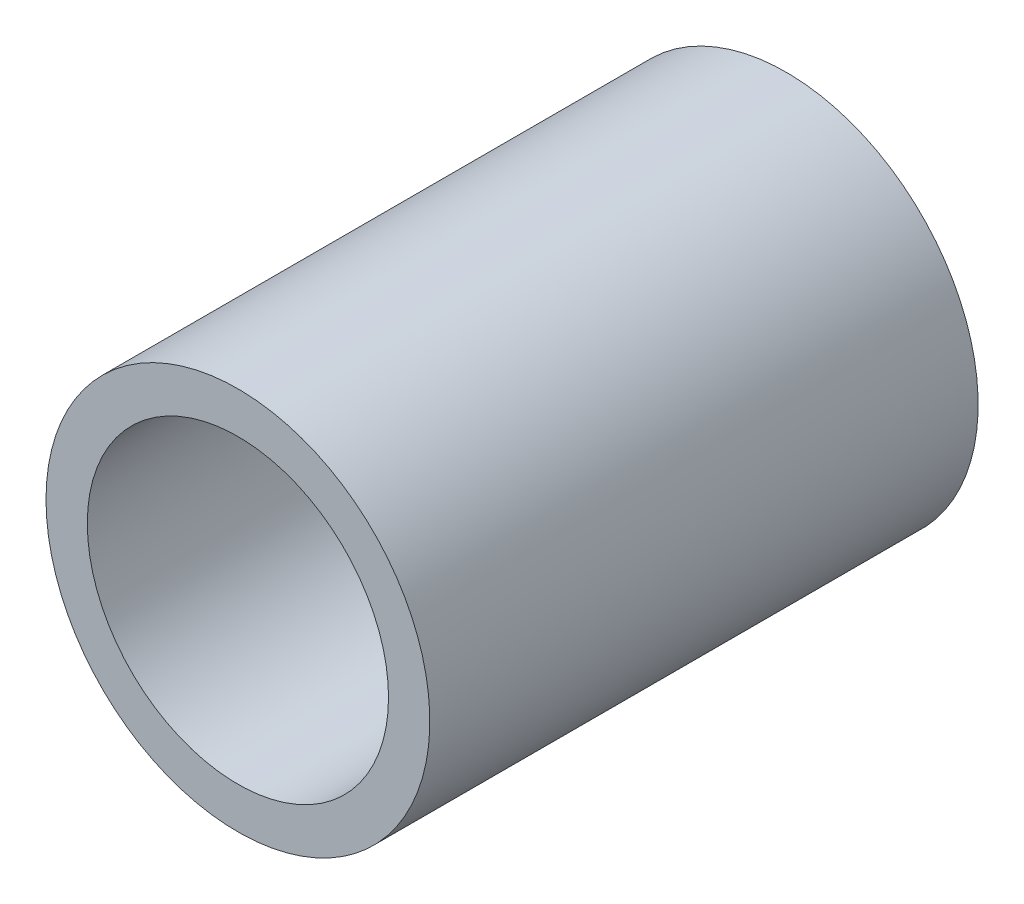
ISO-10303-21;
HEADER;
FILE_DESCRIPTION(('STEP AP214'),'2;1');
FILE_NAME('part.step','',(''),(''),'','','');
FILE_SCHEMA(('AUTOMOTIVE_DESIGN { 1 0 10303 214 1 1 1 1 }'));
ENDSEC;
DATA;
#1=APPLICATION_CONTEXT('core data for automotive mechanical design processes');
#2=APPLICATION_PROTOCOL_DEFINITION('international standard','automotive_design',2000,#1);
#3=PRODUCT_CONTEXT('',#1,'mechanical');
#4=PRODUCT('Part','Part','',(#3));
#5=PRODUCT_RELATED_PRODUCT_CATEGORY('part','',(#4));
#6=PRODUCT_DEFINITION_FORMATION('','',#4);
#7=PRODUCT_DEFINITION_CONTEXT('part definition',#1,'design');
#8=PRODUCT_DEFINITION('design','',#6,#7);
#9=PRODUCT_DEFINITION_SHAPE('','',#8);
#10=(LENGTH_UNIT() NAMED_UNIT(*) SI_UNIT(.MILLI.,.METRE.));
#11=(NAMED_UNIT(*) PLANE_ANGLE_UNIT() SI_UNIT($,.RADIAN.));
#12=(NAMED_UNIT(*) SI_UNIT($,.STERADIAN.) SOLID_ANGLE_UNIT());
#13=UNCERTAINTY_MEASURE_WITH_UNIT(LENGTH_MEASURE(1.E-05),#10,'distance_accuracy_value','');
#14=(GEOMETRIC_REPRESENTATION_CONTEXT(3) GLOBAL_UNCERTAINTY_ASSIGNED_CONTEXT((#13)) GLOBAL_UNIT_ASSIGNED_CONTEXT((#10,
#11,#12)) REPRESENTATION_CONTEXT('',''));
#15=CARTESIAN_POINT('',(0.,0.,0.));
#16=DIRECTION('',(0.,0.,1.));
#17=DIRECTION('',(1.,0.,0.));
#18=AXIS2_PLACEMENT_3D('',#15,#16,#17);
#19=CARTESIAN_POINT('',(0.,0.,38.1));
#20=DIRECTION('',(0.,0.,1.));
#21=DIRECTION('',(1.,0.,0.));
#22=AXIS2_PLACEMENT_3D('',#19,#20,#21);
#23=PLANE('',#22);
#24=CARTESIAN_POINT('',(0.,0.,38.1));
#25=DIRECTION('',(0.,0.,1.));
#26=DIRECTION('',(1.,0.,0.));
#27=AXIS2_PLACEMENT_3D('',#24,#25,#26);
#28=CIRCLE('',#27,13.335);
#29=CARTESIAN_POINT('',(-13.335,0.,38.1));
#30=VERTEX_POINT('',#29);
#31=EDGE_CURVE('E10',#30,#30,#28,.T.);
#32=ORIENTED_EDGE('',*,*,#31,.T.);
#33=EDGE_LOOP('',(#32));
#34=FACE_BOUND('',#33,.T.);
#35=CARTESIAN_POINT('',(0.,0.,38.1));
#36=DIRECTION('',(0.,0.,1.));
#37=DIRECTION('',(1.,0.,0.));
#38=AXIS2_PLACEMENT_3D('',#35,#36,#37);
#39=CIRCLE('',#38,10.4648);
#40=CARTESIAN_POINT('',(-10.4648,0.,38.1));
#41=VERTEX_POINT('',#40);
#42=EDGE_CURVE('E45',#41,#41,#39,.T.);
#43=ORIENTED_EDGE('',*,*,#42,.F.);
#44=EDGE_LOOP('',(#43));
#45=FACE_BOUND('',#44,.T.);
#46=ADVANCED_FACE('F34',(#34,#45),#23,.T.);
#47=CARTESIAN_POINT('',(0.,0.,0.));
#48=DIRECTION('',(0.,0.,1.));
#49=DIRECTION('',(1.,0.,0.));
#50=AXIS2_PLACEMENT_3D('',#47,#48,#49);
#51=PLANE('',#50);
#52=CARTESIAN_POINT('',(0.,0.,0.));
#53=DIRECTION('',(0.,0.,1.));
#54=DIRECTION('',(1.,0.,0.));
#55=AXIS2_PLACEMENT_3D('',#52,#53,#54);
#56=CIRCLE('',#55,13.335);
#57=CARTESIAN_POINT('',(-13.335,0.,0.));
#58=VERTEX_POINT('',#57);
#59=EDGE_CURVE('E38',#58,#58,#56,.T.);
#60=ORIENTED_EDGE('',*,*,#59,.F.);
#61=EDGE_LOOP('',(#60));
#62=FACE_BOUND('',#61,.T.);
#63=CARTESIAN_POINT('',(0.,0.,0.));
#64=DIRECTION('',(0.,0.,1.));
#65=DIRECTION('',(1.,0.,0.));
#66=AXIS2_PLACEMENT_3D('',#63,#64,#65);
#67=CIRCLE('',#66,10.4648);
#68=CARTESIAN_POINT('',(-10.4648,0.,0.));
#69=VERTEX_POINT('',#68);
#70=EDGE_CURVE('E47',#69,#69,#67,.T.);
#71=ORIENTED_EDGE('',*,*,#70,.T.);
#72=EDGE_LOOP('',(#71));
#73=FACE_BOUND('',#72,.T.);
#74=ADVANCED_FACE('F57',(#62,#73),#51,.F.);
#75=CARTESIAN_POINT('',(0.,0.,38.1));
#76=DIRECTION('',(0.,0.,-1.));
#77=DIRECTION('',(-1.,0.,0.));
#78=AXIS2_PLACEMENT_3D('',#75,#76,#77);
#79=CYLINDRICAL_SURFACE('',#78,13.335);
#80=CARTESIAN_POINT('',(-13.335,0.,38.1));
#81=CARTESIAN_POINT('',(-13.335,0.,37.703125));
#82=CARTESIAN_POINT('',(-13.335,0.,37.30625));
#83=CARTESIAN_POINT('',(-13.335,0.,36.5125));
#84=CARTESIAN_POINT('',(-13.335,0.,36.115625));
#85=CARTESIAN_POINT('',(-13.335,0.,35.321875));
#86=CARTESIAN_POINT('',(-13.335,0.,34.925));
#87=CARTESIAN_POINT('',(-13.335,0.,34.13125));
#88=CARTESIAN_POINT('',(-13.335,0.,33.734375));
#89=CARTESIAN_POINT('',(-13.335,0.,32.940625));
#90=CARTESIAN_POINT('',(-13.335,0.,32.54375));
#91=CARTESIAN_POINT('',(-13.335,0.,31.75));
#92=CARTESIAN_POINT('',(-13.335,0.,31.353125));
#93=CARTESIAN_POINT('',(-13.335,0.,30.559375));
#94=CARTESIAN_POINT('',(-13.335,0.,30.1625));
#95=CARTESIAN_POINT('',(-13.335,0.,29.36875));
#96=CARTESIAN_POINT('',(-13.335,0.,28.971875));
#97=CARTESIAN_POINT('',(-13.335,0.,28.178125));
#98=CARTESIAN_POINT('',(-13.335,0.,27.78125));
#99=CARTESIAN_POINT('',(-13.335,0.,26.9875));
#100=CARTESIAN_POINT('',(-13.335,0.,26.590625));
#101=CARTESIAN_POINT('',(-13.335,0.,25.796875));
#102=CARTESIAN_POINT('',(-13.335,0.,25.4));
#103=CARTESIAN_POINT('',(-13.335,0.,24.60625));
#104=CARTESIAN_POINT('',(-13.335,0.,24.209375));
#105=CARTESIAN_POINT('',(-13.335,0.,23.415625));
#106=CARTESIAN_POINT('',(-13.335,0.,23.01875));
#107=CARTESIAN_POINT('',(-13.335,0.,22.225));
#108=CARTESIAN_POINT('',(-13.335,0.,21.828125));
#109=CARTESIAN_POINT('',(-13.335,0.,21.034375));
#110=CARTESIAN_POINT('',(-13.335,0.,20.6375));
#111=CARTESIAN_POINT('',(-13.335,0.,19.84375));
#112=CARTESIAN_POINT('',(-13.335,0.,19.446875));
#113=CARTESIAN_POINT('',(-13.335,0.,18.653125));
#114=CARTESIAN_POINT('',(-13.335,0.,18.25625));
#115=CARTESIAN_POINT('',(-13.335,0.,17.4625));
#116=CARTESIAN_POINT('',(-13.335,0.,17.065625));
#117=CARTESIAN_POINT('',(-13.335,0.,16.271875));
#118=CARTESIAN_POINT('',(-13.335,0.,15.875));
#119=CARTESIAN_POINT('',(-13.335,0.,15.08125));
#120=CARTESIAN_POINT('',(-13.335,0.,14.684375));
#121=CARTESIAN_POINT('',(-13.335,0.,13.890625));
#122=CARTESIAN_POINT('',(-13.335,0.,13.49375));
#123=CARTESIAN_POINT('',(-13.335,0.,12.7));
#124=CARTESIAN_POINT('',(-13.335,0.,12.303125));
#125=CARTESIAN_POINT('',(-13.335,0.,11.509375));
#126=CARTESIAN_POINT('',(-13.335,0.,11.1125));
#127=CARTESIAN_POINT('',(-13.335,0.,10.31875));
#128=CARTESIAN_POINT('',(-13.335,0.,9.92187499999999));
#129=CARTESIAN_POINT('',(-13.335,0.,9.128125));
#130=CARTESIAN_POINT('',(-13.335,0.,8.73124999999999));
#131=CARTESIAN_POINT('',(-13.335,0.,7.93749999999999));
#132=CARTESIAN_POINT('',(-13.335,0.,7.54062499999999));
#133=CARTESIAN_POINT('',(-13.335,0.,6.746875));
#134=CARTESIAN_POINT('',(-13.335,0.,6.35));
#135=CARTESIAN_POINT('',(-13.335,0.,5.55625));
#136=CARTESIAN_POINT('',(-13.335,0.,5.159375));
#137=CARTESIAN_POINT('',(-13.335,0.,4.365625));
#138=CARTESIAN_POINT('',(-13.335,0.,3.96875));
#139=CARTESIAN_POINT('',(-13.335,0.,3.175));
#140=CARTESIAN_POINT('',(-13.335,0.,2.778125));
#141=CARTESIAN_POINT('',(-13.335,0.,1.984375));
#142=CARTESIAN_POINT('',(-13.335,0.,1.5875));
#143=CARTESIAN_POINT('',(-13.335,0.,0.79375));
#144=CARTESIAN_POINT('',(-13.335,0.,0.396875));
#145=CARTESIAN_POINT('',(-13.335,0.,0.));
#146=B_SPLINE_CURVE_WITH_KNOTS('',3,(#80,#81,#82,#83,#84,#85,#86,#87,#88,#89,#90,#91,#92,#93,
#94,#95,#96,#97,#98,#99,#100,#101,#102,#103,#104,#105,#106,#107,#108,#109,#110,#111,#112,#113,
#114,#115,#116,#117,#118,#119,#120,#121,#122,#123,#124,#125,#126,#127,#128,#129,#130,#131,#132,
#133,#134,#135,#136,#137,#138,#139,#140,#141,#142,#143,#144,#145),.UNSPECIFIED.,.F.,.F.,(4,2,2,
2,2,2,2,2,2,2,2,2,2,2,2,2,2,2,2,2,2,2,2,2,2,2,2,2,2,2,2,2,4),(0.,1.190625,2.38125,3.571875,
4.7625,5.953125,7.14375,8.334375,9.52500000000001,10.715625,11.90625,13.096875,14.2875,
15.478125,16.66875,17.859375,19.05,20.240625,21.43125,22.621875,23.8125,25.003125,26.19375,
27.384375,28.575,29.765625,30.95625,32.146875,33.3375,34.528125,35.71875,36.909375,38.1),.UNSPECIFIED.);
#147=EDGE_CURVE('BSEAM36',#30,#58,#146,.T.);
#148=ORIENTED_EDGE('',*,*,#31,.F.);
#149=ORIENTED_EDGE('',*,*,#59,.T.);
#150=ORIENTED_EDGE('',*,*,#147,.T.);
#151=ORIENTED_EDGE('',*,*,#147,.F.);
#152=EDGE_LOOP('',(#148,#150,#149,#151));
#153=FACE_BOUND('',#152,.T.);
#154=ADVANCED_FACE('F36',(#153),#79,.T.);
#155=CARTESIAN_POINT('',(0.,0.,38.1));
#156=DIRECTION('',(0.,0.,-1.));
#157=DIRECTION('',(-1.,0.,0.));
#158=AXIS2_PLACEMENT_3D('',#155,#156,#157);
#159=CYLINDRICAL_SURFACE('',#158,10.4648);
#160=CARTESIAN_POINT('',(-10.4648,0.,38.1));
#161=CARTESIAN_POINT('',(-10.4648,0.,37.703125));
#162=CARTESIAN_POINT('',(-10.4648,0.,37.30625));
#163=CARTESIAN_POINT('',(-10.4648,0.,36.5125));
#164=CARTESIAN_POINT('',(-10.4648,0.,36.115625));
#165=CARTESIAN_POINT('',(-10.4648,0.,35.321875));
#166=CARTESIAN_POINT('',(-10.4648,0.,34.925));
#167=CARTESIAN_POINT('',(-10.4648,0.,34.13125));
#168=CARTESIAN_POINT('',(-10.4648,0.,33.734375));
#169=CARTESIAN_POINT('',(-10.4648,0.,32.940625));
#170=CARTESIAN_POINT('',(-10.4648,0.,32.54375));
#171=CARTESIAN_POINT('',(-10.4648,0.,31.75));
#172=CARTESIAN_POINT('',(-10.4648,0.,31.353125));
#173=CARTESIAN_POINT('',(-10.4648,0.,30.559375));
#174=CARTESIAN_POINT('',(-10.4648,0.,30.1625));
#175=CARTESIAN_POINT('',(-10.4648,0.,29.36875));
#176=CARTESIAN_POINT('',(-10.4648,0.,28.971875));
#177=CARTESIAN_POINT('',(-10.4648,0.,28.178125));
#178=CARTESIAN_POINT('',(-10.4648,0.,27.78125));
#179=CARTESIAN_POINT('',(-10.4648,0.,26.9875));
#180=CARTESIAN_POINT('',(-10.4648,0.,26.590625));
#181=CARTESIAN_POINT('',(-10.4648,0.,25.796875));
#182=CARTESIAN_POINT('',(-10.4648,0.,25.4));
#183=CARTESIAN_POINT('',(-10.4648,0.,24.60625));
#184=CARTESIAN_POINT('',(-10.4648,0.,24.209375));
#185=CARTESIAN_POINT('',(-10.4648,0.,23.415625));
#186=CARTESIAN_POINT('',(-10.4648,0.,23.01875));
#187=CARTESIAN_POINT('',(-10.4648,0.,22.225));
#188=CARTESIAN_POINT('',(-10.4648,0.,21.828125));
#189=CARTESIAN_POINT('',(-10.4648,0.,21.034375));
#190=CARTESIAN_POINT('',(-10.4648,0.,20.6375));
#191=CARTESIAN_POINT('',(-10.4648,0.,19.84375));
#192=CARTESIAN_POINT('',(-10.4648,0.,19.446875));
#193=CARTESIAN_POINT('',(-10.4648,0.,18.653125));
#194=CARTESIAN_POINT('',(-10.4648,0.,18.25625));
#195=CARTESIAN_POINT('',(-10.4648,0.,17.4625));
#196=CARTESIAN_POINT('',(-10.4648,0.,17.065625));
#197=CARTESIAN_POINT('',(-10.4648,0.,16.271875));
#198=CARTESIAN_POINT('',(-10.4648,0.,15.875));
#199=CARTESIAN_POINT('',(-10.4648,0.,15.08125));
#200=CARTESIAN_POINT('',(-10.4648,0.,14.684375));
#201=CARTESIAN_POINT('',(-10.4648,0.,13.890625));
#202=CARTESIAN_POINT('',(-10.4648,0.,13.49375));
#203=CARTESIAN_POINT('',(-10.4648,0.,12.7));
#204=CARTESIAN_POINT('',(-10.4648,0.,12.303125));
#205=CARTESIAN_POINT('',(-10.4648,0.,11.509375));
#206=CARTESIAN_POINT('',(-10.4648,0.,11.1125));
#207=CARTESIAN_POINT('',(-10.4648,0.,10.31875));
#208=CARTESIAN_POINT('',(-10.4648,0.,9.92187499999999));
#209=CARTESIAN_POINT('',(-10.4648,0.,9.128125));
#210=CARTESIAN_POINT('',(-10.4648,0.,8.73124999999999));
#211=CARTESIAN_POINT('',(-10.4648,0.,7.93749999999999));
#212=CARTESIAN_POINT('',(-10.4648,0.,7.54062499999999));
#213=CARTESIAN_POINT('',(-10.4648,0.,6.746875));
#214=CARTESIAN_POINT('',(-10.4648,0.,6.35));
#215=CARTESIAN_POINT('',(-10.4648,0.,5.55625));
#216=CARTESIAN_POINT('',(-10.4648,0.,5.159375));
#217=CARTESIAN_POINT('',(-10.4648,0.,4.365625));
#218=CARTESIAN_POINT('',(-10.4648,0.,3.96875));
#219=CARTESIAN_POINT('',(-10.4648,0.,3.175));
#220=CARTESIAN_POINT('',(-10.4648,0.,2.778125));
#221=CARTESIAN_POINT('',(-10.4648,0.,1.984375));
#222=CARTESIAN_POINT('',(-10.4648,0.,1.5875));
#223=CARTESIAN_POINT('',(-10.4648,0.,0.79375));
#224=CARTESIAN_POINT('',(-10.4648,0.,0.396875));
#225=CARTESIAN_POINT('',(-10.4648,0.,0.));
#226=B_SPLINE_CURVE_WITH_KNOTS('',3,(#160,#161,#162,#163,#164,#165,#166,#167,#168,#169,#170,
#171,#172,#173,#174,#175,#176,#177,#178,#179,#180,#181,#182,#183,#184,#185,#186,#187,#188,#189,
#190,#191,#192,#193,#194,#195,#196,#197,#198,#199,#200,#201,#202,#203,#204,#205,#206,#207,#208,
#209,#210,#211,#212,#213,#214,#215,#216,#217,#218,#219,#220,#221,#222,#223,#224,#225),
.UNSPECIFIED.,.F.,.F.,(4,2,2,2,2,2,2,2,2,2,2,2,2,2,2,2,2,2,2,2,2,2,2,2,2,2,2,2,2,2,2,2,4),(0.,
1.190625,2.38125,3.571875,4.7625,5.953125,7.14375,8.334375,9.52500000000001,10.715625,11.90625,
13.096875,14.2875,15.478125,16.66875,17.859375,19.05,20.240625,21.43125,22.621875,23.8125,
25.003125,26.19375,27.384375,28.575,29.765625,30.95625,32.146875,33.3375,34.528125,35.71875,
36.909375,38.1),.UNSPECIFIED.);
#227=EDGE_CURVE('BSEAM53',#41,#69,#226,.T.);
#228=ORIENTED_EDGE('',*,*,#42,.T.);
#229=ORIENTED_EDGE('',*,*,#70,.F.);
#230=ORIENTED_EDGE('',*,*,#227,.T.);
#231=ORIENTED_EDGE('',*,*,#227,.F.);
#232=EDGE_LOOP('',(#228,#230,#229,#231));
#233=FACE_BOUND('',#232,.T.);
#234=ADVANCED_FACE('F53',(#233),#159,.F.);
#235=CLOSED_SHELL('',(#46,#74,#154,#234));
#236=MANIFOLD_SOLID_BREP('B2',#235);
#237=ADVANCED_BREP_SHAPE_REPRESENTATION('',(#18,#236),#14);
#238=SHAPE_DEFINITION_REPRESENTATION(#9,#237);
ENDSEC;
END-ISO-10303-21;
